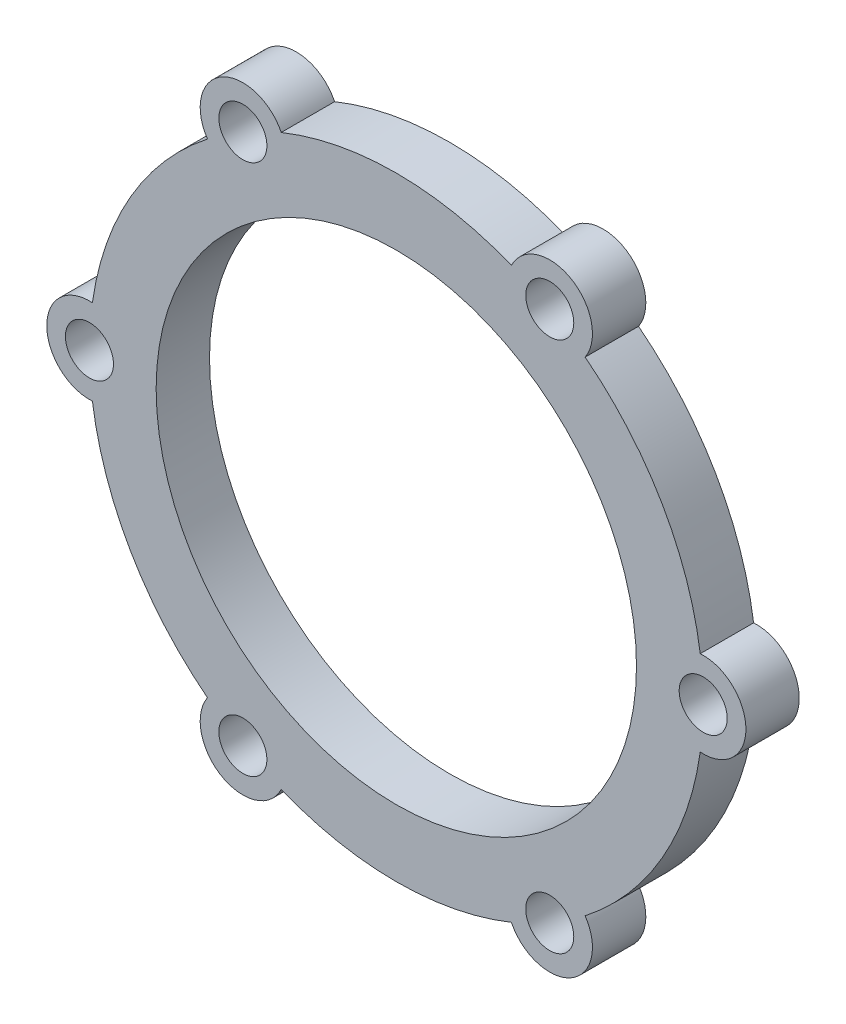
ISO-10303-21;
HEADER;
FILE_DESCRIPTION(('STEP AP214'),'2;1');
FILE_NAME('part.step','',(''),(''),'','','');
FILE_SCHEMA(('AUTOMOTIVE_DESIGN { 1 0 10303 214 1 1 1 1 }'));
ENDSEC;
DATA;
#1=APPLICATION_CONTEXT('core data for automotive mechanical design processes');
#2=APPLICATION_PROTOCOL_DEFINITION('international standard','automotive_design',2000,#1);
#3=PRODUCT_CONTEXT('',#1,'mechanical');
#4=PRODUCT('Part','Part','',(#3));
#5=PRODUCT_RELATED_PRODUCT_CATEGORY('part','',(#4));
#6=PRODUCT_DEFINITION_FORMATION('','',#4);
#7=PRODUCT_DEFINITION_CONTEXT('part definition',#1,'design');
#8=PRODUCT_DEFINITION('design','',#6,#7);
#9=PRODUCT_DEFINITION_SHAPE('','',#8);
#10=(LENGTH_UNIT() NAMED_UNIT(*) SI_UNIT(.MILLI.,.METRE.));
#11=(NAMED_UNIT(*) PLANE_ANGLE_UNIT() SI_UNIT($,.RADIAN.));
#12=(NAMED_UNIT(*) SI_UNIT($,.STERADIAN.) SOLID_ANGLE_UNIT());
#13=UNCERTAINTY_MEASURE_WITH_UNIT(LENGTH_MEASURE(1.E-05),#10,'distance_accuracy_value','');
#14=(GEOMETRIC_REPRESENTATION_CONTEXT(3) GLOBAL_UNCERTAINTY_ASSIGNED_CONTEXT((#13)) GLOBAL_UNIT_ASSIGNED_CONTEXT((#10,
#11,#12)) REPRESENTATION_CONTEXT('',''));
#15=CARTESIAN_POINT('',(0.,0.,0.));
#16=DIRECTION('',(0.,0.,1.));
#17=DIRECTION('',(1.,0.,0.));
#18=AXIS2_PLACEMENT_3D('',#15,#16,#17);
#19=CARTESIAN_POINT('',(-57.5,3.92047505570758E-13,10.));
#20=DIRECTION('',(0.,0.,-1.));
#21=DIRECTION('',(-1.,0.,0.));
#22=AXIS2_PLACEMENT_3D('',#19,#20,#21);
#23=CYLINDRICAL_SURFACE('',#22,8.);
#24=CARTESIAN_POINT('',(-57.5,3.92047505570758E-13,0.));
#25=DIRECTION('',(0.,0.,1.));
#26=DIRECTION('',(1.,0.,0.));
#27=AXIS2_PLACEMENT_3D('',#24,#25,#26);
#28=CIRCLE('',#27,8.);
#29=CARTESIAN_POINT('',(-56.9434782608695,7.98061924626663,0.));
#30=VERTEX_POINT('',#29);
#31=CARTESIAN_POINT('',(-56.9434782608696,-7.98061924626585,0.));
#32=VERTEX_POINT('',#31);
#33=EDGE_CURVE('E200',#30,#32,#28,.T.);
#34=ORIENTED_EDGE('',*,*,#33,.T.);
#35=DIRECTION('',(0.,0.,-1.));
#36=VECTOR('',#35,1.);
#37=CARTESIAN_POINT('',(-56.9434782608696,-7.98061924626585,10.));
#38=LINE('',#37,#36);
#39=CARTESIAN_POINT('',(-56.9434782608696,-7.98061924626585,10.));
#40=VERTEX_POINT('',#39);
#41=EDGE_CURVE('E11',#40,#32,#38,.T.);
#42=ORIENTED_EDGE('',*,*,#41,.F.);
#43=CARTESIAN_POINT('',(-57.5,3.92047505570758E-13,10.));
#44=DIRECTION('',(0.,0.,1.));
#45=DIRECTION('',(1.,0.,0.));
#46=AXIS2_PLACEMENT_3D('',#43,#44,#45);
#47=CIRCLE('',#46,8.);
#48=CARTESIAN_POINT('',(-56.9434782608695,7.98061924626663,10.));
#49=VERTEX_POINT('',#48);
#50=EDGE_CURVE('E252',#49,#40,#47,.T.);
#51=ORIENTED_EDGE('',*,*,#50,.F.);
#52=DIRECTION('',(0.,0.,-1.));
#53=VECTOR('',#52,1.);
#54=CARTESIAN_POINT('',(-56.9434782608695,7.98061924626663,10.));
#55=LINE('',#54,#53);
#56=EDGE_CURVE('E199',#49,#30,#55,.T.);
#57=ORIENTED_EDGE('',*,*,#56,.T.);
#58=EDGE_LOOP('',(#34,#42,#51,#57));
#59=FACE_BOUND('',#58,.T.);
#60=ADVANCED_FACE('F45',(#59),#23,.T.);
#61=CARTESIAN_POINT('',(0.,0.,10.));
#62=DIRECTION('',(0.,0.,-1.));
#63=DIRECTION('',(-1.,0.,0.));
#64=AXIS2_PLACEMENT_3D('',#61,#62,#63);
#65=CYLINDRICAL_SURFACE('',#64,57.5);
#66=CARTESIAN_POINT('',(0.,0.,0.));
#67=DIRECTION('',(0.,0.,1.));
#68=DIRECTION('',(1.,0.,0.));
#69=AXIS2_PLACEMENT_3D('',#66,#67,#68);
#70=CIRCLE('',#69,57.5);
#71=CARTESIAN_POINT('',(-35.3831581356325,-45.3241891306268,0.));
#72=VERTEX_POINT('',#71);
#73=EDGE_CURVE('E204',#32,#72,#70,.T.);
#74=ORIENTED_EDGE('',*,*,#73,.T.);
#75=DIRECTION('',(0.,0.,-1.));
#76=VECTOR('',#75,1.);
#77=CARTESIAN_POINT('',(-35.3831581356325,-45.3241891306268,10.));
#78=LINE('',#77,#76);
#79=CARTESIAN_POINT('',(-35.3831581356325,-45.3241891306268,10.));
#80=VERTEX_POINT('',#79);
#81=EDGE_CURVE('E54',#80,#72,#78,.T.);
#82=ORIENTED_EDGE('',*,*,#81,.F.);
#83=CARTESIAN_POINT('',(0.,0.,10.));
#84=DIRECTION('',(0.,0.,1.));
#85=DIRECTION('',(1.,0.,0.));
#86=AXIS2_PLACEMENT_3D('',#83,#84,#85);
#87=CIRCLE('',#86,57.5);
#88=EDGE_CURVE('E117',#40,#80,#87,.T.);
#89=ORIENTED_EDGE('',*,*,#88,.F.);
#90=ORIENTED_EDGE('',*,*,#41,.T.);
#91=EDGE_LOOP('',(#74,#82,#89,#90));
#92=FACE_BOUND('',#91,.T.);
#93=ADVANCED_FACE('F340',(#92),#65,.T.);
#94=CARTESIAN_POINT('',(-28.7499999999999,-49.7964607176053,10.));
#95=DIRECTION('',(0.,0.,-1.));
#96=DIRECTION('',(-1.,0.,0.));
#97=AXIS2_PLACEMENT_3D('',#94,#95,#96);
#98=CYLINDRICAL_SURFACE('',#97,8.00000000000028);
#99=CARTESIAN_POINT('',(-28.7499999999999,-49.7964607176053,0.));
#100=DIRECTION('',(0.,0.,1.));
#101=DIRECTION('',(1.,0.,0.));
#102=AXIS2_PLACEMENT_3D('',#99,#100,#101);
#103=CIRCLE('',#102,8.00000000000028);
#104=CARTESIAN_POINT('',(-21.5603201252368,-53.3048083768933,0.));
#105=VERTEX_POINT('',#104);
#106=EDGE_CURVE('E207',#72,#105,#103,.T.);
#107=ORIENTED_EDGE('',*,*,#106,.T.);
#108=DIRECTION('',(0.,0.,-1.));
#109=VECTOR('',#108,1.);
#110=CARTESIAN_POINT('',(-21.5603201252368,-53.3048083768933,10.));
#111=LINE('',#110,#109);
#112=CARTESIAN_POINT('',(-21.5603201252368,-53.3048083768933,10.));
#113=VERTEX_POINT('',#112);
#114=EDGE_CURVE('E279',#113,#105,#111,.T.);
#115=ORIENTED_EDGE('',*,*,#114,.F.);
#116=CARTESIAN_POINT('',(-28.7499999999999,-49.7964607176053,10.));
#117=DIRECTION('',(0.,0.,1.));
#118=DIRECTION('',(1.,0.,0.));
#119=AXIS2_PLACEMENT_3D('',#116,#117,#118);
#120=CIRCLE('',#119,8.00000000000028);
#121=EDGE_CURVE('E289',#80,#113,#120,.T.);
#122=ORIENTED_EDGE('',*,*,#121,.F.);
#123=ORIENTED_EDGE('',*,*,#81,.T.);
#124=EDGE_LOOP('',(#107,#115,#122,#123));
#125=FACE_BOUND('',#124,.T.);
#126=ADVANCED_FACE('F287',(#125),#98,.T.);
#127=CARTESIAN_POINT('',(21.5603201252371,-53.3048083768931,0.));
#128=VERTEX_POINT('',#127);
#129=EDGE_CURVE('E208',#105,#128,#70,.T.);
#130=ORIENTED_EDGE('',*,*,#129,.T.);
#131=DIRECTION('',(0.,0.,-1.));
#132=VECTOR('',#131,1.);
#133=CARTESIAN_POINT('',(21.5603201252371,-53.3048083768931,10.));
#134=LINE('',#133,#132);
#135=CARTESIAN_POINT('',(21.5603201252371,-53.3048083768931,10.));
#136=VERTEX_POINT('',#135);
#137=EDGE_CURVE('E275',#136,#128,#134,.T.);
#138=ORIENTED_EDGE('',*,*,#137,.F.);
#139=EDGE_CURVE('E313',#113,#136,#87,.T.);
#140=ORIENTED_EDGE('',*,*,#139,.F.);
#141=ORIENTED_EDGE('',*,*,#114,.T.);
#142=EDGE_LOOP('',(#130,#138,#140,#141));
#143=FACE_BOUND('',#142,.T.);
#144=ADVANCED_FACE('F352',(#143),#65,.T.);
#145=CARTESIAN_POINT('',(28.7499999999999,-49.7964607176053,10.));
#146=DIRECTION('',(0.,0.,-1.));
#147=DIRECTION('',(-1.,0.,0.));
#148=AXIS2_PLACEMENT_3D('',#145,#146,#147);
#149=CYLINDRICAL_SURFACE('',#148,8.);
#150=CARTESIAN_POINT('',(28.7499999999999,-49.7964607176053,0.));
#151=DIRECTION('',(0.,0.,1.));
#152=DIRECTION('',(1.,0.,0.));
#153=AXIS2_PLACEMENT_3D('',#150,#151,#152);
#154=CIRCLE('',#153,8.);
#155=CARTESIAN_POINT('',(35.3831581356323,-45.3241891306269,0.));
#156=VERTEX_POINT('',#155);
#157=EDGE_CURVE('E211',#128,#156,#154,.T.);
#158=ORIENTED_EDGE('',*,*,#157,.T.);
#159=DIRECTION('',(0.,0.,-1.));
#160=VECTOR('',#159,1.);
#161=CARTESIAN_POINT('',(35.3831581356323,-45.3241891306269,10.));
#162=LINE('',#161,#160);
#163=CARTESIAN_POINT('',(35.3831581356323,-45.3241891306269,10.));
#164=VERTEX_POINT('',#163);
#165=EDGE_CURVE('E271',#164,#156,#162,.T.);
#166=ORIENTED_EDGE('',*,*,#165,.F.);
#167=CARTESIAN_POINT('',(28.7499999999999,-49.7964607176053,10.));
#168=DIRECTION('',(0.,0.,1.));
#169=DIRECTION('',(1.,0.,0.));
#170=AXIS2_PLACEMENT_3D('',#167,#168,#169);
#171=CIRCLE('',#170,8.);
#172=EDGE_CURVE('E317',#136,#164,#171,.T.);
#173=ORIENTED_EDGE('',*,*,#172,.F.);
#174=ORIENTED_EDGE('',*,*,#137,.T.);
#175=EDGE_LOOP('',(#158,#166,#173,#174));
#176=FACE_BOUND('',#175,.T.);
#177=ADVANCED_FACE('F372',(#176),#149,.T.);
#178=CARTESIAN_POINT('',(56.9434782608696,-7.98061924626622,0.));
#179=VERTEX_POINT('',#178);
#180=EDGE_CURVE('E214',#156,#179,#70,.T.);
#181=ORIENTED_EDGE('',*,*,#180,.T.);
#182=DIRECTION('',(0.,0.,-1.));
#183=VECTOR('',#182,1.);
#184=CARTESIAN_POINT('',(56.9434782608696,-7.98061924626622,10.));
#185=LINE('',#184,#183);
#186=CARTESIAN_POINT('',(56.9434782608696,-7.98061924626622,10.));
#187=VERTEX_POINT('',#186);
#188=EDGE_CURVE('E267',#187,#179,#185,.T.);
#189=ORIENTED_EDGE('',*,*,#188,.F.);
#190=EDGE_CURVE('E318',#164,#187,#87,.T.);
#191=ORIENTED_EDGE('',*,*,#190,.F.);
#192=ORIENTED_EDGE('',*,*,#165,.T.);
#193=EDGE_LOOP('',(#181,#189,#191,#192));
#194=FACE_BOUND('',#193,.T.);
#195=ADVANCED_FACE('F373',(#194),#65,.T.);
#196=CARTESIAN_POINT('',(57.5,0.,10.));
#197=DIRECTION('',(0.,0.,-1.));
#198=DIRECTION('',(-1.,0.,0.));
#199=AXIS2_PLACEMENT_3D('',#196,#197,#198);
#200=CYLINDRICAL_SURFACE('',#199,8.);
#201=CARTESIAN_POINT('',(57.5,0.,0.));
#202=DIRECTION('',(0.,0.,1.));
#203=DIRECTION('',(1.,0.,0.));
#204=AXIS2_PLACEMENT_3D('',#201,#202,#203);
#205=CIRCLE('',#204,8.);
#206=CARTESIAN_POINT('',(56.9434782608696,7.98061924626627,0.));
#207=VERTEX_POINT('',#206);
#208=EDGE_CURVE('E215',#179,#207,#205,.T.);
#209=ORIENTED_EDGE('',*,*,#208,.T.);
#210=DIRECTION('',(0.,0.,-1.));
#211=VECTOR('',#210,1.);
#212=CARTESIAN_POINT('',(56.9434782608696,7.98061924626627,10.));
#213=LINE('',#212,#211);
#214=CARTESIAN_POINT('',(56.9434782608696,7.98061924626627,10.));
#215=VERTEX_POINT('',#214);
#216=EDGE_CURVE('E263',#215,#207,#213,.T.);
#217=ORIENTED_EDGE('',*,*,#216,.F.);
#218=CARTESIAN_POINT('',(57.5,0.,10.));
#219=DIRECTION('',(0.,0.,1.));
#220=DIRECTION('',(1.,0.,0.));
#221=AXIS2_PLACEMENT_3D('',#218,#219,#220);
#222=CIRCLE('',#221,8.);
#223=EDGE_CURVE('E322',#187,#215,#222,.T.);
#224=ORIENTED_EDGE('',*,*,#223,.F.);
#225=ORIENTED_EDGE('',*,*,#188,.T.);
#226=EDGE_LOOP('',(#209,#217,#224,#225));
#227=FACE_BOUND('',#226,.T.);
#228=ADVANCED_FACE('F386',(#227),#200,.T.);
#229=CARTESIAN_POINT('',(35.3831581356323,45.3241891306269,0.));
#230=VERTEX_POINT('',#229);
#231=EDGE_CURVE('E218',#207,#230,#70,.T.);
#232=ORIENTED_EDGE('',*,*,#231,.T.);
#233=DIRECTION('',(0.,0.,-1.));
#234=VECTOR('',#233,1.);
#235=CARTESIAN_POINT('',(35.3831581356323,45.3241891306269,10.));
#236=LINE('',#235,#234);
#237=CARTESIAN_POINT('',(35.3831581356323,45.3241891306269,10.));
#238=VERTEX_POINT('',#237);
#239=EDGE_CURVE('E259',#238,#230,#236,.T.);
#240=ORIENTED_EDGE('',*,*,#239,.F.);
#241=EDGE_CURVE('E155',#215,#238,#87,.T.);
#242=ORIENTED_EDGE('',*,*,#241,.F.);
#243=ORIENTED_EDGE('',*,*,#216,.T.);
#244=EDGE_LOOP('',(#232,#240,#242,#243));
#245=FACE_BOUND('',#244,.T.);
#246=ADVANCED_FACE('F328',(#245),#65,.T.);
#247=CARTESIAN_POINT('',(28.7499999999999,49.7964607176053,10.));
#248=DIRECTION('',(0.,0.,-1.));
#249=DIRECTION('',(-1.,0.,0.));
#250=AXIS2_PLACEMENT_3D('',#247,#248,#249);
#251=CYLINDRICAL_SURFACE('',#250,8.);
#252=CARTESIAN_POINT('',(28.7499999999999,49.7964607176053,0.));
#253=DIRECTION('',(0.,0.,1.));
#254=DIRECTION('',(1.,0.,0.));
#255=AXIS2_PLACEMENT_3D('',#252,#253,#254);
#256=CIRCLE('',#255,8.);
#257=CARTESIAN_POINT('',(21.5603201252371,53.3048083768931,0.));
#258=VERTEX_POINT('',#257);
#259=EDGE_CURVE('E219',#230,#258,#256,.T.);
#260=ORIENTED_EDGE('',*,*,#259,.T.);
#261=DIRECTION('',(0.,0.,-1.));
#262=VECTOR('',#261,1.);
#263=CARTESIAN_POINT('',(21.5603201252371,53.3048083768931,10.));
#264=LINE('',#263,#262);
#265=CARTESIAN_POINT('',(21.5603201252371,53.3048083768931,10.));
#266=VERTEX_POINT('',#265);
#267=EDGE_CURVE('E161',#266,#258,#264,.T.);
#268=ORIENTED_EDGE('',*,*,#267,.F.);
#269=CARTESIAN_POINT('',(28.7499999999999,49.7964607176053,10.));
#270=DIRECTION('',(0.,0.,1.));
#271=DIRECTION('',(1.,0.,0.));
#272=AXIS2_PLACEMENT_3D('',#269,#270,#271);
#273=CIRCLE('',#272,8.);
#274=EDGE_CURVE('E149',#238,#266,#273,.T.);
#275=ORIENTED_EDGE('',*,*,#274,.F.);
#276=ORIENTED_EDGE('',*,*,#239,.T.);
#277=EDGE_LOOP('',(#260,#268,#275,#276));
#278=FACE_BOUND('',#277,.T.);
#279=ADVANCED_FACE('F331',(#278),#251,.T.);
#280=CARTESIAN_POINT('',(-21.5603201252367,53.3048083768933,0.));
#281=VERTEX_POINT('',#280);
#282=EDGE_CURVE('E159',#258,#281,#70,.T.);
#283=ORIENTED_EDGE('',*,*,#282,.T.);
#284=DIRECTION('',(0.,0.,-1.));
#285=VECTOR('',#284,1.);
#286=CARTESIAN_POINT('',(-21.5603201252367,53.3048083768933,10.));
#287=LINE('',#286,#285);
#288=CARTESIAN_POINT('',(-21.5603201252367,53.3048083768933,10.));
#289=VERTEX_POINT('',#288);
#290=EDGE_CURVE('E156',#289,#281,#287,.T.);
#291=ORIENTED_EDGE('',*,*,#290,.F.);
#292=EDGE_CURVE('E142',#266,#289,#87,.T.);
#293=ORIENTED_EDGE('',*,*,#292,.F.);
#294=ORIENTED_EDGE('',*,*,#267,.T.);
#295=EDGE_LOOP('',(#283,#291,#293,#294));
#296=FACE_BOUND('',#295,.T.);
#297=ADVANCED_FACE('F157',(#296),#65,.T.);
#298=CARTESIAN_POINT('',(-28.7499999999996,49.7964607176055,10.));
#299=DIRECTION('',(0.,0.,-1.));
#300=DIRECTION('',(-1.,0.,0.));
#301=AXIS2_PLACEMENT_3D('',#298,#299,#300);
#302=CYLINDRICAL_SURFACE('',#301,8.);
#303=CARTESIAN_POINT('',(-28.7499999999996,49.7964607176055,0.));
#304=DIRECTION('',(0.,0.,1.));
#305=DIRECTION('',(1.,0.,0.));
#306=AXIS2_PLACEMENT_3D('',#303,#304,#305);
#307=CIRCLE('',#306,8.);
#308=CARTESIAN_POINT('',(-35.383158135632,45.3241891306272,0.));
#309=VERTEX_POINT('',#308);
#310=EDGE_CURVE('E103',#281,#309,#307,.T.);
#311=ORIENTED_EDGE('',*,*,#310,.T.);
#312=DIRECTION('',(0.,0.,-1.));
#313=VECTOR('',#312,1.);
#314=CARTESIAN_POINT('',(-35.383158135632,45.3241891306272,10.));
#315=LINE('',#314,#313);
#316=CARTESIAN_POINT('',(-35.383158135632,45.3241891306272,10.));
#317=VERTEX_POINT('',#316);
#318=EDGE_CURVE('E162',#317,#309,#315,.T.);
#319=ORIENTED_EDGE('',*,*,#318,.F.);
#320=CARTESIAN_POINT('',(-28.7499999999996,49.7964607176055,10.));
#321=DIRECTION('',(0.,0.,1.));
#322=DIRECTION('',(1.,0.,0.));
#323=AXIS2_PLACEMENT_3D('',#320,#321,#322);
#324=CIRCLE('',#323,8.);
#325=EDGE_CURVE('E147',#289,#317,#324,.T.);
#326=ORIENTED_EDGE('',*,*,#325,.F.);
#327=ORIENTED_EDGE('',*,*,#290,.T.);
#328=EDGE_LOOP('',(#311,#319,#326,#327));
#329=FACE_BOUND('',#328,.T.);
#330=ADVANCED_FACE('F164',(#329),#302,.T.);
#331=CARTESIAN_POINT('',(28.7499999999999,49.7964607176053,10.));
#332=DIRECTION('',(0.,0.,-1.));
#333=DIRECTION('',(-1.,0.,0.));
#334=AXIS2_PLACEMENT_3D('',#331,#332,#333);
#335=CYLINDRICAL_SURFACE('',#334,4.5);
#336=CARTESIAN_POINT('',(28.7499999999999,49.7964607176053,10.));
#337=DIRECTION('',(0.,0.,1.));
#338=DIRECTION('',(1.,0.,0.));
#339=AXIS2_PLACEMENT_3D('',#336,#337,#338);
#340=CIRCLE('',#339,4.5);
#341=CARTESIAN_POINT('',(33.2499999999999,49.7964607176053,10.));
#342=VERTEX_POINT('',#341);
#343=EDGE_CURVE('E191',#342,#342,#340,.T.);
#344=ORIENTED_EDGE('',*,*,#343,.T.);
#345=EDGE_LOOP('',(#344));
#346=FACE_BOUND('',#345,.T.);
#347=CARTESIAN_POINT('',(28.7499999999999,49.7964607176053,0.));
#348=DIRECTION('',(0.,0.,1.));
#349=DIRECTION('',(1.,0.,0.));
#350=AXIS2_PLACEMENT_3D('',#347,#348,#349);
#351=CIRCLE('',#350,4.5);
#352=CARTESIAN_POINT('',(33.2499999999999,49.7964607176053,0.));
#353=VERTEX_POINT('',#352);
#354=EDGE_CURVE('E244',#353,#353,#351,.T.);
#355=ORIENTED_EDGE('',*,*,#354,.F.);
#356=EDGE_LOOP('',(#355));
#357=FACE_BOUND('',#356,.T.);
#358=ADVANCED_FACE('F414',(#346,#357),#335,.F.);
#359=CARTESIAN_POINT('',(-28.7499999999996,49.7964607176055,10.));
#360=DIRECTION('',(0.,0.,-1.));
#361=DIRECTION('',(-1.,0.,0.));
#362=AXIS2_PLACEMENT_3D('',#359,#360,#361);
#363=CYLINDRICAL_SURFACE('',#362,4.5);
#364=CARTESIAN_POINT('',(-28.7499999999996,49.7964607176055,10.));
#365=DIRECTION('',(0.,0.,1.));
#366=DIRECTION('',(1.,0.,0.));
#367=AXIS2_PLACEMENT_3D('',#364,#365,#366);
#368=CIRCLE('',#367,4.5);
#369=CARTESIAN_POINT('',(-24.2499999999996,49.7964607176055,10.));
#370=VERTEX_POINT('',#369);
#371=EDGE_CURVE('E187',#370,#370,#368,.T.);
#372=ORIENTED_EDGE('',*,*,#371,.T.);
#373=EDGE_LOOP('',(#372));
#374=FACE_BOUND('',#373,.T.);
#375=CARTESIAN_POINT('',(-28.7499999999996,49.7964607176055,0.));
#376=DIRECTION('',(0.,0.,1.));
#377=DIRECTION('',(1.,0.,0.));
#378=AXIS2_PLACEMENT_3D('',#375,#376,#377);
#379=CIRCLE('',#378,4.5);
#380=CARTESIAN_POINT('',(-24.2499999999996,49.7964607176055,0.));
#381=VERTEX_POINT('',#380);
#382=EDGE_CURVE('E240',#381,#381,#379,.T.);
#383=ORIENTED_EDGE('',*,*,#382,.F.);
#384=EDGE_LOOP('',(#383));
#385=FACE_BOUND('',#384,.T.);
#386=ADVANCED_FACE('F420',(#374,#385),#363,.F.);
#387=CARTESIAN_POINT('',(57.5,0.,10.));
#388=DIRECTION('',(0.,0.,-1.));
#389=DIRECTION('',(-1.,0.,0.));
#390=AXIS2_PLACEMENT_3D('',#387,#388,#389);
#391=CYLINDRICAL_SURFACE('',#390,4.49999999999999);
#392=CARTESIAN_POINT('',(57.5,0.,10.));
#393=DIRECTION('',(0.,0.,1.));
#394=DIRECTION('',(1.,0.,0.));
#395=AXIS2_PLACEMENT_3D('',#392,#393,#394);
#396=CIRCLE('',#395,4.49999999999999);
#397=CARTESIAN_POINT('',(62.,0.,10.));
#398=VERTEX_POINT('',#397);
#399=EDGE_CURVE('E183',#398,#398,#396,.T.);
#400=ORIENTED_EDGE('',*,*,#399,.T.);
#401=EDGE_LOOP('',(#400));
#402=FACE_BOUND('',#401,.T.);
#403=CARTESIAN_POINT('',(57.5,0.,0.));
#404=DIRECTION('',(0.,0.,1.));
#405=DIRECTION('',(1.,0.,0.));
#406=AXIS2_PLACEMENT_3D('',#403,#404,#405);
#407=CIRCLE('',#406,4.49999999999999);
#408=CARTESIAN_POINT('',(62.,0.,0.));
#409=VERTEX_POINT('',#408);
#410=EDGE_CURVE('E236',#409,#409,#407,.T.);
#411=ORIENTED_EDGE('',*,*,#410,.F.);
#412=EDGE_LOOP('',(#411));
#413=FACE_BOUND('',#412,.T.);
#414=ADVANCED_FACE('F428',(#402,#413),#391,.F.);
#415=CARTESIAN_POINT('',(28.7499999999999,-49.7964607176053,10.));
#416=DIRECTION('',(0.,0.,-1.));
#417=DIRECTION('',(-1.,0.,0.));
#418=AXIS2_PLACEMENT_3D('',#415,#416,#417);
#419=CYLINDRICAL_SURFACE('',#418,4.5);
#420=CARTESIAN_POINT('',(28.7499999999999,-49.7964607176053,10.));
#421=DIRECTION('',(0.,0.,1.));
#422=DIRECTION('',(1.,0.,0.));
#423=AXIS2_PLACEMENT_3D('',#420,#421,#422);
#424=CIRCLE('',#423,4.5);
#425=CARTESIAN_POINT('',(33.2499999999999,-49.7964607176053,10.));
#426=VERTEX_POINT('',#425);
#427=EDGE_CURVE('E179',#426,#426,#424,.T.);
#428=ORIENTED_EDGE('',*,*,#427,.T.);
#429=EDGE_LOOP('',(#428));
#430=FACE_BOUND('',#429,.T.);
#431=CARTESIAN_POINT('',(28.7499999999999,-49.7964607176053,0.));
#432=DIRECTION('',(0.,0.,1.));
#433=DIRECTION('',(1.,0.,0.));
#434=AXIS2_PLACEMENT_3D('',#431,#432,#433);
#435=CIRCLE('',#434,4.5);
#436=CARTESIAN_POINT('',(33.2499999999999,-49.7964607176053,0.));
#437=VERTEX_POINT('',#436);
#438=EDGE_CURVE('E232',#437,#437,#435,.T.);
#439=ORIENTED_EDGE('',*,*,#438,.F.);
#440=EDGE_LOOP('',(#439));
#441=FACE_BOUND('',#440,.T.);
#442=ADVANCED_FACE('F436',(#430,#441),#419,.F.);
#443=CARTESIAN_POINT('',(-28.7499999999999,-49.7964607176053,10.));
#444=DIRECTION('',(0.,0.,-1.));
#445=DIRECTION('',(-1.,0.,0.));
#446=AXIS2_PLACEMENT_3D('',#443,#444,#445);
#447=CYLINDRICAL_SURFACE('',#446,4.50000000000028);
#448=CARTESIAN_POINT('',(-28.7499999999999,-49.7964607176053,10.));
#449=DIRECTION('',(0.,0.,1.));
#450=DIRECTION('',(1.,0.,0.));
#451=AXIS2_PLACEMENT_3D('',#448,#449,#450);
#452=CIRCLE('',#451,4.50000000000028);
#453=CARTESIAN_POINT('',(-24.2499999999996,-49.7964607176053,10.));
#454=VERTEX_POINT('',#453);
#455=EDGE_CURVE('E175',#454,#454,#452,.T.);
#456=ORIENTED_EDGE('',*,*,#455,.T.);
#457=EDGE_LOOP('',(#456));
#458=FACE_BOUND('',#457,.T.);
#459=CARTESIAN_POINT('',(-28.7499999999999,-49.7964607176053,0.));
#460=DIRECTION('',(0.,0.,1.));
#461=DIRECTION('',(1.,0.,0.));
#462=AXIS2_PLACEMENT_3D('',#459,#460,#461);
#463=CIRCLE('',#462,4.50000000000028);
#464=CARTESIAN_POINT('',(-24.2499999999996,-49.7964607176053,0.));
#465=VERTEX_POINT('',#464);
#466=EDGE_CURVE('E228',#465,#465,#463,.T.);
#467=ORIENTED_EDGE('',*,*,#466,.F.);
#468=EDGE_LOOP('',(#467));
#469=FACE_BOUND('',#468,.T.);
#470=ADVANCED_FACE('F347',(#458,#469),#447,.F.);
#471=CARTESIAN_POINT('',(-57.5,3.92047505570758E-13,10.));
#472=DIRECTION('',(0.,0.,-1.));
#473=DIRECTION('',(-1.,0.,0.));
#474=AXIS2_PLACEMENT_3D('',#471,#472,#473);
#475=CYLINDRICAL_SURFACE('',#474,4.49999999999999);
#476=CARTESIAN_POINT('',(-57.5,3.92047505570758E-13,10.));
#477=DIRECTION('',(0.,0.,1.));
#478=DIRECTION('',(1.,0.,0.));
#479=AXIS2_PLACEMENT_3D('',#476,#477,#478);
#480=CIRCLE('',#479,4.49999999999999);
#481=CARTESIAN_POINT('',(-53.,3.92047505570758E-13,10.));
#482=VERTEX_POINT('',#481);
#483=EDGE_CURVE('E168',#482,#482,#480,.T.);
#484=ORIENTED_EDGE('',*,*,#483,.T.);
#485=EDGE_LOOP('',(#484));
#486=FACE_BOUND('',#485,.T.);
#487=CARTESIAN_POINT('',(-57.5,3.92047505570758E-13,0.));
#488=DIRECTION('',(0.,0.,1.));
#489=DIRECTION('',(1.,0.,0.));
#490=AXIS2_PLACEMENT_3D('',#487,#488,#489);
#491=CIRCLE('',#490,4.49999999999999);
#492=CARTESIAN_POINT('',(-53.,3.92047505570758E-13,0.));
#493=VERTEX_POINT('',#492);
#494=EDGE_CURVE('E224',#493,#493,#491,.T.);
#495=ORIENTED_EDGE('',*,*,#494,.F.);
#496=EDGE_LOOP('',(#495));
#497=FACE_BOUND('',#496,.T.);
#498=ADVANCED_FACE('F338',(#486,#497),#475,.F.);
#499=EDGE_CURVE('E109',#309,#30,#70,.T.);
#500=ORIENTED_EDGE('',*,*,#499,.T.);
#501=ORIENTED_EDGE('',*,*,#56,.F.);
#502=EDGE_CURVE('E62',#317,#49,#87,.T.);
#503=ORIENTED_EDGE('',*,*,#502,.F.);
#504=ORIENTED_EDGE('',*,*,#318,.T.);
#505=EDGE_LOOP('',(#500,#501,#503,#504));
#506=FACE_BOUND('',#505,.T.);
#507=ADVANCED_FACE('F335',(#506),#65,.T.);
#508=CARTESIAN_POINT('',(0.,0.,10.));
#509=DIRECTION('',(0.,0.,-1.));
#510=DIRECTION('',(-1.,0.,0.));
#511=AXIS2_PLACEMENT_3D('',#508,#509,#510);
#512=CYLINDRICAL_SURFACE('',#511,45.);
#513=CARTESIAN_POINT('',(0.,0.,10.));
#514=DIRECTION('',(0.,0.,1.));
#515=DIRECTION('',(1.,0.,0.));
#516=AXIS2_PLACEMENT_3D('',#513,#514,#515);
#517=CIRCLE('',#516,45.);
#518=CARTESIAN_POINT('',(45.,0.,10.));
#519=VERTEX_POINT('',#518);
#520=EDGE_CURVE('E195',#519,#519,#517,.T.);
#521=ORIENTED_EDGE('',*,*,#520,.T.);
#522=EDGE_LOOP('',(#521));
#523=FACE_BOUND('',#522,.T.);
#524=CARTESIAN_POINT('',(0.,0.,0.));
#525=DIRECTION('',(0.,0.,1.));
#526=DIRECTION('',(1.,0.,0.));
#527=AXIS2_PLACEMENT_3D('',#524,#525,#526);
#528=CIRCLE('',#527,45.);
#529=CARTESIAN_POINT('',(45.,0.,0.));
#530=VERTEX_POINT('',#529);
#531=EDGE_CURVE('E248',#530,#530,#528,.T.);
#532=ORIENTED_EDGE('',*,*,#531,.F.);
#533=EDGE_LOOP('',(#532));
#534=FACE_BOUND('',#533,.T.);
#535=ADVANCED_FACE('F337',(#523,#534),#512,.F.);
#536=CARTESIAN_POINT('',(0.,0.,10.));
#537=DIRECTION('',(0.,0.,1.));
#538=DIRECTION('',(1.,0.,0.));
#539=AXIS2_PLACEMENT_3D('',#536,#537,#538);
#540=PLANE('',#539);
#541=ORIENTED_EDGE('',*,*,#50,.T.);
#542=ORIENTED_EDGE('',*,*,#88,.T.);
#543=ORIENTED_EDGE('',*,*,#121,.T.);
#544=ORIENTED_EDGE('',*,*,#139,.T.);
#545=ORIENTED_EDGE('',*,*,#172,.T.);
#546=ORIENTED_EDGE('',*,*,#190,.T.);
#547=ORIENTED_EDGE('',*,*,#223,.T.);
#548=ORIENTED_EDGE('',*,*,#241,.T.);
#549=ORIENTED_EDGE('',*,*,#274,.T.);
#550=ORIENTED_EDGE('',*,*,#292,.T.);
#551=ORIENTED_EDGE('',*,*,#325,.T.);
#552=ORIENTED_EDGE('',*,*,#502,.T.);
#553=EDGE_LOOP('',(#541,#542,#543,#544,#545,#546,#547,#548,#549,#550,#551,#552));
#554=FACE_BOUND('',#553,.T.);
#555=ORIENTED_EDGE('',*,*,#483,.F.);
#556=EDGE_LOOP('',(#555));
#557=FACE_BOUND('',#556,.T.);
#558=ORIENTED_EDGE('',*,*,#455,.F.);
#559=EDGE_LOOP('',(#558));
#560=FACE_BOUND('',#559,.T.);
#561=ORIENTED_EDGE('',*,*,#427,.F.);
#562=EDGE_LOOP('',(#561));
#563=FACE_BOUND('',#562,.T.);
#564=ORIENTED_EDGE('',*,*,#399,.F.);
#565=EDGE_LOOP('',(#564));
#566=FACE_BOUND('',#565,.T.);
#567=ORIENTED_EDGE('',*,*,#371,.F.);
#568=EDGE_LOOP('',(#567));
#569=FACE_BOUND('',#568,.T.);
#570=ORIENTED_EDGE('',*,*,#343,.F.);
#571=EDGE_LOOP('',(#570));
#572=FACE_BOUND('',#571,.T.);
#573=ORIENTED_EDGE('',*,*,#520,.F.);
#574=EDGE_LOOP('',(#573));
#575=FACE_BOUND('',#574,.T.);
#576=ADVANCED_FACE('F144',(#554,#557,#560,#563,#566,#569,#572,#575),#540,.T.);
#577=CARTESIAN_POINT('',(0.,0.,0.));
#578=DIRECTION('',(0.,0.,1.));
#579=DIRECTION('',(1.,0.,0.));
#580=AXIS2_PLACEMENT_3D('',#577,#578,#579);
#581=PLANE('',#580);
#582=ORIENTED_EDGE('',*,*,#33,.F.);
#583=ORIENTED_EDGE('',*,*,#499,.F.);
#584=ORIENTED_EDGE('',*,*,#310,.F.);
#585=ORIENTED_EDGE('',*,*,#282,.F.);
#586=ORIENTED_EDGE('',*,*,#259,.F.);
#587=ORIENTED_EDGE('',*,*,#231,.F.);
#588=ORIENTED_EDGE('',*,*,#208,.F.);
#589=ORIENTED_EDGE('',*,*,#180,.F.);
#590=ORIENTED_EDGE('',*,*,#157,.F.);
#591=ORIENTED_EDGE('',*,*,#129,.F.);
#592=ORIENTED_EDGE('',*,*,#106,.F.);
#593=ORIENTED_EDGE('',*,*,#73,.F.);
#594=EDGE_LOOP('',(#582,#583,#584,#585,#586,#587,#588,#589,#590,#591,#592,#593));
#595=FACE_BOUND('',#594,.T.);
#596=ORIENTED_EDGE('',*,*,#494,.T.);
#597=EDGE_LOOP('',(#596));
#598=FACE_BOUND('',#597,.T.);
#599=ORIENTED_EDGE('',*,*,#466,.T.);
#600=EDGE_LOOP('',(#599));
#601=FACE_BOUND('',#600,.T.);
#602=ORIENTED_EDGE('',*,*,#438,.T.);
#603=EDGE_LOOP('',(#602));
#604=FACE_BOUND('',#603,.T.);
#605=ORIENTED_EDGE('',*,*,#410,.T.);
#606=EDGE_LOOP('',(#605));
#607=FACE_BOUND('',#606,.T.);
#608=ORIENTED_EDGE('',*,*,#382,.T.);
#609=EDGE_LOOP('',(#608));
#610=FACE_BOUND('',#609,.T.);
#611=ORIENTED_EDGE('',*,*,#354,.T.);
#612=EDGE_LOOP('',(#611));
#613=FACE_BOUND('',#612,.T.);
#614=ORIENTED_EDGE('',*,*,#531,.T.);
#615=EDGE_LOOP('',(#614));
#616=FACE_BOUND('',#615,.T.);
#617=ADVANCED_FACE('F293',(#595,#598,#601,#604,#607,#610,#613,#616),#581,.F.);
#618=CLOSED_SHELL('',(#60,#93,#126,#144,#177,#195,#228,#246,#279,#297,#330,#358,#386,#414,#442,
#470,#498,#507,#535,#576,#617));
#619=MANIFOLD_SOLID_BREP('B2',#618);
#620=ADVANCED_BREP_SHAPE_REPRESENTATION('',(#18,#619),#14);
#621=SHAPE_DEFINITION_REPRESENTATION(#9,#620);
ENDSEC;
END-ISO-10303-21;
